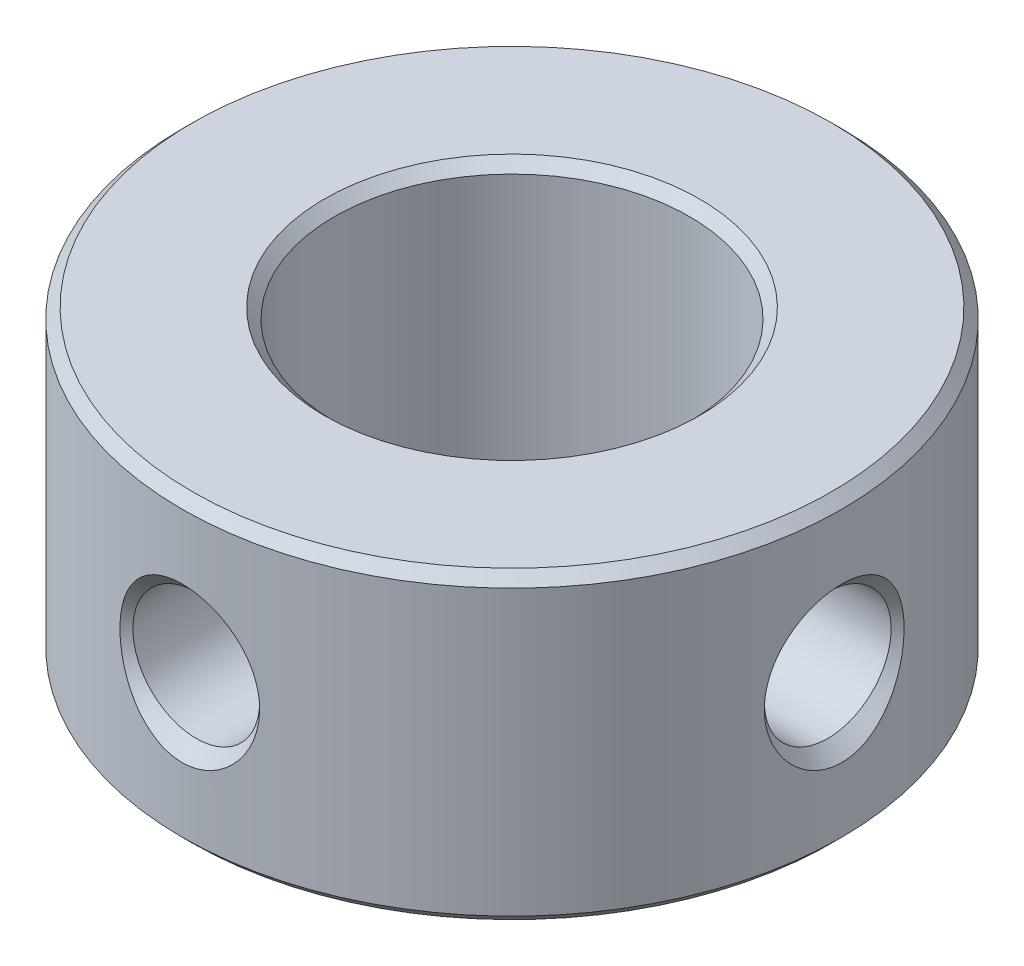
ISO-10303-21;
HEADER;
FILE_DESCRIPTION(('STEP AP214'),'2;1');
FILE_NAME('part.step','',(''),(''),'','','');
FILE_SCHEMA(('AUTOMOTIVE_DESIGN { 1 0 10303 214 1 1 1 1 }'));
ENDSEC;
DATA;
#1=APPLICATION_CONTEXT('core data for automotive mechanical design processes');
#2=APPLICATION_PROTOCOL_DEFINITION('international standard','automotive_design',2000,#1);
#3=PRODUCT_CONTEXT('',#1,'mechanical');
#4=PRODUCT('Part','Part','',(#3));
#5=PRODUCT_RELATED_PRODUCT_CATEGORY('part','',(#4));
#6=PRODUCT_DEFINITION_FORMATION('','',#4);
#7=PRODUCT_DEFINITION_CONTEXT('part definition',#1,'design');
#8=PRODUCT_DEFINITION('design','',#6,#7);
#9=PRODUCT_DEFINITION_SHAPE('','',#8);
#10=(LENGTH_UNIT() NAMED_UNIT(*) SI_UNIT(.MILLI.,.METRE.));
#11=(NAMED_UNIT(*) PLANE_ANGLE_UNIT() SI_UNIT($,.RADIAN.));
#12=(NAMED_UNIT(*) SI_UNIT($,.STERADIAN.) SOLID_ANGLE_UNIT());
#13=UNCERTAINTY_MEASURE_WITH_UNIT(LENGTH_MEASURE(1.E-05),#10,'distance_accuracy_value','');
#14=(GEOMETRIC_REPRESENTATION_CONTEXT(3) GLOBAL_UNCERTAINTY_ASSIGNED_CONTEXT((#13)) GLOBAL_UNIT_ASSIGNED_CONTEXT((#10,
#11,#12)) REPRESENTATION_CONTEXT('',''));
#15=CARTESIAN_POINT('',(0.,0.,0.));
#16=DIRECTION('',(0.,0.,1.));
#17=DIRECTION('',(1.,0.,0.));
#18=AXIS2_PLACEMENT_3D('',#15,#16,#17);
#19=CARTESIAN_POINT('',(0.,3.,0.));
#20=DIRECTION('',(0.,1.,0.));
#21=DIRECTION('',(0.,0.,1.));
#22=AXIS2_PLACEMENT_3D('',#19,#20,#21);
#23=PLANE('',#22);
#24=CARTESIAN_POINT('',(0.,3.,0.));
#25=DIRECTION('',(0.,1.,0.));
#26=DIRECTION('',(0.,0.,1.));
#27=AXIS2_PLACEMENT_3D('',#24,#25,#26);
#28=CIRCLE('',#27,3.7);
#29=CARTESIAN_POINT('',(0.,3.,3.7));
#30=VERTEX_POINT('',#29);
#31=EDGE_CURVE('E44',#30,#30,#28,.F.);
#32=ORIENTED_EDGE('',*,*,#31,.T.);
#33=EDGE_LOOP('',(#32));
#34=FACE_BOUND('',#33,.T.);
#35=CARTESIAN_POINT('',(0.,3.,0.));
#36=DIRECTION('',(0.,1.,0.));
#37=DIRECTION('',(0.,0.,1.));
#38=AXIS2_PLACEMENT_3D('',#35,#36,#37);
#39=CIRCLE('',#38,6.30000000000001);
#40=CARTESIAN_POINT('',(0.,3.,6.30000000000001));
#41=VERTEX_POINT('',#40);
#42=EDGE_CURVE('E66',#41,#41,#39,.T.);
#43=ORIENTED_EDGE('',*,*,#42,.T.);
#44=EDGE_LOOP('',(#43));
#45=FACE_BOUND('',#44,.T.);
#46=ADVANCED_FACE('F37',(#34,#45),#23,.T.);
#47=CARTESIAN_POINT('',(0.,-3.,0.));
#48=DIRECTION('',(0.,1.,0.));
#49=DIRECTION('',(0.,0.,1.));
#50=AXIS2_PLACEMENT_3D('',#47,#48,#49);
#51=PLANE('',#50);
#52=CARTESIAN_POINT('',(0.,-3.,0.));
#53=DIRECTION('',(0.,1.,0.));
#54=DIRECTION('',(0.,0.,1.));
#55=AXIS2_PLACEMENT_3D('',#52,#53,#54);
#56=CIRCLE('',#55,3.7);
#57=CARTESIAN_POINT('',(0.,-3.,3.7));
#58=VERTEX_POINT('',#57);
#59=EDGE_CURVE('E10',#58,#58,#56,.T.);
#60=ORIENTED_EDGE('',*,*,#59,.T.);
#61=EDGE_LOOP('',(#60));
#62=FACE_BOUND('',#61,.T.);
#63=CARTESIAN_POINT('',(0.,-3.,0.));
#64=DIRECTION('',(0.,1.,0.));
#65=DIRECTION('',(0.,0.,1.));
#66=AXIS2_PLACEMENT_3D('',#63,#64,#65);
#67=CIRCLE('',#66,6.3);
#68=CARTESIAN_POINT('',(0.,-3.,6.3));
#69=VERTEX_POINT('',#68);
#70=EDGE_CURVE('E57',#69,#69,#67,.F.);
#71=ORIENTED_EDGE('',*,*,#70,.T.);
#72=EDGE_LOOP('',(#71));
#73=FACE_BOUND('',#72,.T.);
#74=ADVANCED_FACE('F135',(#62,#73),#51,.F.);
#75=CARTESIAN_POINT('',(0.,3.,0.));
#76=DIRECTION('',(0.,-1.,0.));
#77=DIRECTION('',(0.,0.,-1.));
#78=AXIS2_PLACEMENT_3D('',#75,#76,#77);
#79=CYLINDRICAL_SURFACE('',#78,6.5);
#80=CARTESIAN_POINT('',(0.,2.8,0.));
#81=DIRECTION('',(0.,1.,0.));
#82=DIRECTION('',(0.,0.,1.));
#83=AXIS2_PLACEMENT_3D('',#80,#81,#82);
#84=CIRCLE('',#83,6.5);
#85=CARTESIAN_POINT('',(0.,2.8,6.5));
#86=VERTEX_POINT('',#85);
#87=EDGE_CURVE('E60',#86,#86,#84,.F.);
#88=ORIENTED_EDGE('',*,*,#87,.T.);
#89=EDGE_LOOP('',(#88));
#90=FACE_BOUND('',#89,.T.);
#91=CARTESIAN_POINT('',(0.,-2.8,0.));
#92=DIRECTION('',(0.,1.,0.));
#93=DIRECTION('',(0.,0.,1.));
#94=AXIS2_PLACEMENT_3D('',#91,#92,#93);
#95=CIRCLE('',#94,6.5);
#96=CARTESIAN_POINT('',(0.,-2.8,6.5));
#97=VERTEX_POINT('',#96);
#98=EDGE_CURVE('E63',#97,#97,#95,.T.);
#99=ORIENTED_EDGE('',*,*,#98,.T.);
#100=EDGE_LOOP('',(#99));
#101=FACE_BOUND('',#100,.T.);
#102=CARTESIAN_POINT('',(6.42056992446142,-1.03120826473283,-1.01305572553223));
#103=CARTESIAN_POINT('',(6.42775297660594,-1.08600611799098,-0.96752777206796));
#104=CARTESIAN_POINT('',(6.43506091626371,-1.13751719904323,-0.91807306619704));
#105=CARTESIAN_POINT('',(6.44930918051218,-1.232613736802,-0.811957919524479));
#106=CARTESIAN_POINT('',(6.45624943673801,-1.27619772323139,-0.755296145297524));
#107=CARTESIAN_POINT('',(6.46996026371588,-1.35909118242102,-0.627874714036797));
#108=CARTESIAN_POINT('',(6.47658997864783,-1.3970964971294,-0.556240431657065));
#109=CARTESIAN_POINT('',(6.4876766929064,-1.45912721179365,-0.406977974836262));
#110=CARTESIAN_POINT('',(6.49213461107373,-1.48315852468505,-0.329352351334137));
#111=CARTESIAN_POINT('',(6.49793086636362,-1.51414063143304,-0.178842291100535));
#112=CARTESIAN_POINT('',(6.49953900934897,-1.52257253494381,-0.106271857011151));
#113=CARTESIAN_POINT('',(6.50028804329199,-1.5265172385592,0.0392150998172214));
#114=CARTESIAN_POINT('',(6.49943003342442,-1.52203579419536,0.112131453915148));
#115=CARTESIAN_POINT('',(6.49547730671636,-1.50105511691168,0.251736262088822));
#116=CARTESIAN_POINT('',(6.49251688537915,-1.48527700794963,0.318539002443912));
#117=CARTESIAN_POINT('',(6.48482621762537,-1.44324485039578,0.448641542650498));
#118=CARTESIAN_POINT('',(6.48009577534416,-1.41698964242151,0.511940953945028));
#119=CARTESIAN_POINT('',(6.4691485903118,-1.35400244867261,0.635697968065564));
#120=CARTESIAN_POINT('',(6.46288641765774,-1.31694188553753,0.695983532255673));
#121=CARTESIAN_POINT('',(6.44957465131465,-1.23410230078908,0.810120430818683));
#122=CARTESIAN_POINT('',(6.44252478075131,-1.18832020956367,0.863969488919078));
#123=CARTESIAN_POINT('',(6.42757207945128,-1.0846468795005,0.969232991908438));
#124=CARTESIAN_POINT('',(6.41965245294934,-1.02601432085761,1.01991446746227));
#125=CARTESIAN_POINT('',(6.40438282866366,-0.901668149027933,1.111779483364));
#126=CARTESIAN_POINT('',(6.39703307615064,-0.835951515659995,1.15295894899897));
#127=CARTESIAN_POINT('',(6.3829041702812,-0.692244906097387,1.22889300887401));
#128=CARTESIAN_POINT('',(6.37625533233603,-0.613684659646156,1.26259506039481));
#129=CARTESIAN_POINT('',(6.3651691824102,-0.452124650893197,1.31734705865975));
#130=CARTESIAN_POINT('',(6.36073251298569,-0.369123606440751,1.33839332971575));
#131=CARTESIAN_POINT('',(6.35435352091555,-0.195798283722955,1.36837387948942));
#132=CARTESIAN_POINT('',(6.35257375269303,-0.10533081540766,1.37652055982645));
#133=CARTESIAN_POINT('',(6.35222654524265,0.0757456225128137,1.37812086852558));
#134=CARTESIAN_POINT('',(6.35365957103593,0.16635461070475,1.37157236990124));
#135=CARTESIAN_POINT('',(6.35962077389388,0.346692683048276,1.3436629628585));
#136=CARTESIAN_POINT('',(6.36419929699948,0.436383003235264,1.32206103114876));
#137=CARTESIAN_POINT('',(6.37595363128211,0.610732079941575,1.26415306792286));
#138=CARTESIAN_POINT('',(6.38312975289345,0.695390233667342,1.22784527887449));
#139=CARTESIAN_POINT('',(6.39909268276878,0.85596245908128,1.14170954900369));
#140=CARTESIAN_POINT('',(6.40785744197771,0.931975522598875,1.09206268010014));
#141=CARTESIAN_POINT('',(6.42595912534622,1.07382747734218,0.979929675651589));
#142=CARTESIAN_POINT('',(6.43529590710775,1.13966888642082,0.917446726452141));
#143=CARTESIAN_POINT('',(6.45272631437903,1.25472090146229,0.785169411936411));
#144=CARTESIAN_POINT('',(6.46086101406949,1.30469966987715,0.716051252342381));
#145=CARTESIAN_POINT('',(6.47542291341691,1.39072859232885,0.569467401504466));
#146=CARTESIAN_POINT('',(6.48185180042915,1.42679252679975,0.492010066655373));
#147=CARTESIAN_POINT('',(6.49148973145398,1.47978499517873,0.340147802146137));
#148=CARTESIAN_POINT('',(6.49497477034835,1.49837957855956,0.266341261861067));
#149=CARTESIAN_POINT('',(6.49938646055714,1.52181231816957,0.11651148151863));
#150=CARTESIAN_POINT('',(6.50031474468573,1.5266592540849,0.0404896875511532));
#151=CARTESIAN_POINT('',(6.49952926801496,1.52252000571488,-0.104496291229329));
#152=CARTESIAN_POINT('',(6.49803866044482,1.51470230004381,-0.173498278040829));
#153=CARTESIAN_POINT('',(6.49299773573998,1.48778483720355,-0.309174855344416));
#154=CARTESIAN_POINT('',(6.4894474742052,1.46868538458247,-0.37584950861087));
#155=CARTESIAN_POINT('',(6.48065852401051,1.42003229451611,-0.505257995514456));
#156=CARTESIAN_POINT('',(6.47541681778029,1.39045996399183,-0.56798454483699));
#157=CARTESIAN_POINT('',(6.46376580641177,1.32204067940203,-0.688022231497608));
#158=CARTESIAN_POINT('',(6.45735617866042,1.28319116179123,-0.745331865870592));
#159=CARTESIAN_POINT('',(6.44340668240451,1.19404407206132,-0.857895340394902));
#160=CARTESIAN_POINT('',(6.43581735616053,1.14307618942954,-0.912611227926875));
#161=CARTESIAN_POINT('',(6.42067711164058,1.03342561196945,-1.01366756925442));
#162=CARTESIAN_POINT('',(6.41312621134367,0.974739598896453,-1.06000440018789));
#163=CARTESIAN_POINT('',(6.39797676809255,0.844685826228736,-1.14808561080339));
#164=CARTESIAN_POINT('',(6.39045679763883,0.772633423373907,-1.18883388188948));
#165=CARTESIAN_POINT('',(6.37705459471373,0.62297311177917,-1.25874713791708));
#166=CARTESIAN_POINT('',(6.37117292821394,0.545363294775033,-1.28790812137255));
#167=CARTESIAN_POINT('',(6.36127048576103,0.380455692071845,-1.33599909729117));
#168=CARTESIAN_POINT('',(6.3574252443306,0.292869998054995,-1.35398238557953));
#169=CARTESIAN_POINT('',(6.35274816472732,0.115866262942453,-1.37575971184409));
#170=CARTESIAN_POINT('',(6.35191699778125,0.0264478181559426,-1.37955058921225));
#171=CARTESIAN_POINT('',(6.35338473995798,-0.154457715027122,-1.37277713426655));
#172=CARTESIAN_POINT('',(6.35577625533862,-0.245928468500017,-1.36178810764005));
#173=CARTESIAN_POINT('',(6.3635706376873,-0.425687190421498,-1.32488541563448));
#174=CARTESIAN_POINT('',(6.36897341269661,-0.513975255976299,-1.29897220601375));
#175=CARTESIAN_POINT('',(6.38158197215011,-0.677587063732123,-1.23546006674342));
#176=CARTESIAN_POINT('',(6.3885989202888,-0.75337735113875,-1.19902121120184));
#177=CARTESIAN_POINT('',(6.40387718885821,-0.898020673382277,-1.11453773744126));
#178=CARTESIAN_POINT('',(6.41213750173607,-0.966879250573211,-1.06650249742063));
#179=CARTESIAN_POINT('',(6.42056992446142,-1.03120826473283,-1.01305572553223));
#180=B_SPLINE_CURVE_WITH_KNOTS('',3,(#102,#103,#104,#105,#106,#107,#108,#109,#110,#111,#112,
#113,#114,#115,#116,#117,#118,#119,#120,#121,#122,#123,#124,#125,#126,#127,#128,#129,#130,#131,
#132,#133,#134,#135,#136,#137,#138,#139,#140,#141,#142,#143,#144,#145,#146,#147,#148,#149,#150,
#151,#152,#153,#154,#155,#156,#157,#158,#159,#160,#161,#162,#163,#164,#165,#166,#167,#168,#169,
#170,#171,#172,#173,#174,#175,#176,#177,#178,#179),.UNSPECIFIED.,.T.,.F.,(4,2,2,2,2,2,2,2,2,2,2,
2,2,2,2,2,2,2,2,2,2,2,2,2,2,2,2,2,2,2,2,2,2,2,2,2,2,2,4),(0.,0.214598052119018,
0.429235866292609,0.671939938853738,0.914541239152316,1.13261756724728,1.35059671287416,
1.55577634512187,1.76097868858609,1.97322214224354,2.18554043516989,2.41829066094365,
2.65114051143969,2.90724771686185,3.1634292690318,3.43472077186242,3.70605154407286,
3.98182955834019,4.2576405412277,4.5298817355946,4.80205543205084,5.05766828917701,
5.31302734858503,5.54035320297545,5.76753384710118,5.9749203286562,6.1823012121178,
6.39005413172858,6.59786452582563,6.82242354690523,7.04707942987008,7.29537179280047,
7.54374982519755,7.81101669827976,8.07834308736682,8.35351740141107,8.62868331256052,
8.88081029118063,9.132734049368),.UNSPECIFIED.);
#181=CARTESIAN_POINT('',(6.42056992446142,-1.03120826473283,-1.01305572553223));
#182=VERTEX_POINT('',#181);
#183=EDGE_CURVE('E69',#182,#182,#180,.T.);
#184=ORIENTED_EDGE('',*,*,#183,.T.);
#185=EDGE_LOOP('',(#184));
#186=FACE_BOUND('',#185,.T.);
#187=CARTESIAN_POINT('',(-1.01305572553221,-1.03120826473284,6.42056992446143));
#188=CARTESIAN_POINT('',(-1.06855792016883,-0.964402043234129,6.41181313344496));
#189=CARTESIAN_POINT('',(-1.11826126803628,-0.892661742423104,6.40323585226165));
#190=CARTESIAN_POINT('',(-1.20515376738453,-0.74173739154245,6.38745383378992));
#191=CARTESIAN_POINT('',(-1.24232002369552,-0.662540057115565,6.38025161793321));
#192=CARTESIAN_POINT('',(-1.3035840017811,-0.498788652757108,6.36801778311635));
#193=CARTESIAN_POINT('',(-1.32763872864851,-0.414217962819404,6.36299331626068));
#194=CARTESIAN_POINT('',(-1.3621035153507,-0.242270409758618,6.35570499216741));
#195=CARTESIAN_POINT('',(-1.37251847991746,-0.154894566928164,6.35344014261743));
#196=CARTESIAN_POINT('',(-1.37970645318686,0.0241961779864489,6.35188387182602));
#197=CARTESIAN_POINT('',(-1.37587765027606,0.115936979613137,6.35272361313979));
#198=CARTESIAN_POINT('',(-1.35328301862536,0.297498109988988,6.35757465484518));
#199=CARTESIAN_POINT('',(-1.33451341020379,0.38731794687312,6.36158675776992));
#200=CARTESIAN_POINT('',(-1.28224342000219,0.562821477069545,6.37232794576766));
#201=CARTESIAN_POINT('',(-1.24868133223955,0.648486157821488,6.37906840229397));
#202=CARTESIAN_POINT('',(-1.16737247582061,0.812650601438415,6.3944465405919));
#203=CARTESIAN_POINT('',(-1.11962515015357,0.891150082789759,6.40308429686119));
#204=CARTESIAN_POINT('',(-1.01238514164495,1.03610601930594,6.42089851182052));
#205=CARTESIAN_POINT('',(-0.953272355804817,1.10284525285361,6.43005214636308));
#206=CARTESIAN_POINT('',(-0.823673741146186,1.22428834194806,6.4479314920629));
#207=CARTESIAN_POINT('',(-0.753194688750855,1.27899932293893,6.45665745417615));
#208=CARTESIAN_POINT('',(-0.609124279750986,1.36961321758613,6.47176585693223));
#209=CARTESIAN_POINT('',(-0.536306352409929,1.40671932364067,6.47828443314127));
#210=CARTESIAN_POINT('',(-0.384838304299137,1.46656048735538,6.4890396001056));
#211=CARTESIAN_POINT('',(-0.306194051195555,1.48930978963318,6.49327845215169));
#212=CARTESIAN_POINT('',(-0.154855922063156,1.51738472934114,6.49854631056194));
#213=CARTESIAN_POINT('',(-0.0824783095952934,1.52437241490473,6.49988090763089));
#214=CARTESIAN_POINT('',(0.0623743915535633,1.52554578295943,6.50010354766474));
#215=CARTESIAN_POINT('',(0.134849438702086,1.5197358193918,6.49899242269897));
#216=CARTESIAN_POINT('',(0.273674314571291,1.4963051301437,6.49458762208218));
#217=CARTESIAN_POINT('',(0.340142185443195,1.47934890608643,6.49141685443643));
#218=CARTESIAN_POINT('',(0.469406134664007,1.43507371848097,6.48335218085895));
#219=CARTESIAN_POINT('',(0.532201790437165,1.40775356501369,6.47845807706957));
#220=CARTESIAN_POINT('',(0.655083254729127,1.34259138241244,6.46721147482216));
#221=CARTESIAN_POINT('',(0.714968471109569,1.30438122096042,6.46080962848138));
#222=CARTESIAN_POINT('',(0.82814750894362,1.21932454902524,6.4472805895779));
#223=CARTESIAN_POINT('',(0.881438928617808,1.17247490700968,6.44015313442642));
#224=CARTESIAN_POINT('',(0.985477351366731,1.06657648250303,6.42509651048518));
#225=CARTESIAN_POINT('',(1.03546376654017,1.00678226202533,6.41715719946399));
#226=CARTESIAN_POINT('',(1.12576449379258,0.88021938269342,6.40193373595736));
#227=CARTESIAN_POINT('',(1.16607467824246,0.813447764832675,6.39464986389045));
#228=CARTESIAN_POINT('',(1.23996344693771,0.667753087890553,6.38075597259483));
#229=CARTESIAN_POINT('',(1.27248776929155,0.588280953599429,6.3742830121596));
#230=CARTESIAN_POINT('',(1.3247315951149,0.425087547823282,6.36363092914117));
#231=CARTESIAN_POINT('',(1.34444751747298,0.341365095036177,6.35945244812391));
#232=CARTESIAN_POINT('',(1.37151384930665,0.167002938838669,6.35367286277019));
#233=CARTESIAN_POINT('',(1.37810519584138,0.0762392358161977,6.35223019097852));
#234=CARTESIAN_POINT('',(1.37654202042423,-0.105161237783578,6.35256885203277));
#235=CARTESIAN_POINT('',(1.36838540669164,-0.195797988529772,6.3543506422211));
#236=CARTESIAN_POINT('',(1.33723512580128,-0.375752018828966,6.36097937960916));
#237=CARTESIAN_POINT('',(1.31402586029198,-0.46503051922472,6.36587084608038));
#238=CARTESIAN_POINT('',(1.25295540320063,-0.638272722770767,6.37817118125727));
#239=CARTESIAN_POINT('',(1.21509253053427,-0.722235814842845,6.38558033878442));
#240=CARTESIAN_POINT('',(1.1260304648675,-0.880987953866844,6.40188007186696));
#241=CARTESIAN_POINT('',(1.07503679431001,-0.955894316657009,6.41074711701251));
#242=CARTESIAN_POINT('',(0.960375939736364,-1.09527140203972,6.42892168749749));
#243=CARTESIAN_POINT('',(0.896712413528763,-1.15974512683462,6.43822908511663));
#244=CARTESIAN_POINT('',(0.762588557887169,-1.27170497047912,6.45544150680449));
#245=CARTESIAN_POINT('',(0.692825303467547,-1.32001497879462,6.46339817815128));
#246=CARTESIAN_POINT('',(0.545271338369386,-1.40260348658392,6.47751047498678));
#247=CARTESIAN_POINT('',(0.467488770387951,-1.43689604684734,6.48366790350441));
#248=CARTESIAN_POINT('',(0.315448058977389,-1.48649649853585,6.49273717202138));
#249=CARTESIAN_POINT('',(0.24175514207226,-1.50348757782231,6.49593314369926));
#250=CARTESIAN_POINT('',(0.0924575216098046,-1.52382310142656,6.49977006605623));
#251=CARTESIAN_POINT('',(0.0168540582587083,-1.52717618077157,6.5004126334412));
#252=CARTESIAN_POINT('',(-0.127353079826083,-1.520359324668,6.49911917115738));
#253=CARTESIAN_POINT('',(-0.196014073125215,-1.51129526892918,6.49739399068914));
#254=CARTESIAN_POINT('',(-0.330834187722336,-1.48201330766334,6.4919258879967));
#255=CARTESIAN_POINT('',(-0.396992823998705,-1.46179325153277,6.48818257672951));
#256=CARTESIAN_POINT('',(-0.525576382157717,-1.4109231657829,6.47904019425626));
#257=CARTESIAN_POINT('',(-0.587970494995428,-1.38019801593903,6.4736292261715));
#258=CARTESIAN_POINT('',(-0.707144320183209,-1.30957024640088,6.46169750402781));
#259=CARTESIAN_POINT('',(-0.763927414741669,-1.26967320418682,6.45517742504963));
#260=CARTESIAN_POINT('',(-0.853070915098217,-1.19665371378187,6.44387817382912));
#261=CARTESIAN_POINT('',(-0.887262734717206,-1.16570644076113,6.43924320099983));
#262=CARTESIAN_POINT('',(-0.952532276762943,-1.10070506543029,6.42991195069592));
#263=CARTESIAN_POINT('',(-0.983610082422613,-1.06665104620536,6.42521567486363));
#264=CARTESIAN_POINT('',(-1.01305572553221,-1.03120826473284,6.42056992446143));
#265=B_SPLINE_CURVE_WITH_KNOTS('',3,(#187,#188,#189,#190,#191,#192,#193,#194,#195,#196,#197,
#198,#199,#200,#201,#202,#203,#204,#205,#206,#207,#208,#209,#210,#211,#212,#213,#214,#215,#216,
#217,#218,#219,#220,#221,#222,#223,#224,#225,#226,#227,#228,#229,#230,#231,#232,#233,#234,#235,
#236,#237,#238,#239,#240,#241,#242,#243,#244,#245,#246,#247,#248,#249,#250,#251,#252,#253,#254,
#255,#256,#257,#258,#259,#260,#261,#262,#263,#264),.UNSPECIFIED.,.T.,.F.,(4,2,2,2,2,2,2,2,2,2,2,
2,2,2,2,2,2,2,2,2,2,2,2,2,2,2,2,2,2,2,2,2,2,2,2,2,2,2,4),(0.,0.261709761652983,0.52389490109718,
0.786934695087148,1.04987987641283,1.32405843714444,1.5983063808254,1.87370932427814,
2.1491230833885,2.41656642805268,2.68385091187216,2.92842201901193,3.17275008306625,
3.3897933279594,3.60676274307551,3.81184529672764,4.01695140375685,4.23004035206384,
4.44320669058574,4.67725388064131,4.91140073244233,5.16861264147254,5.42589643368387,
5.69767220384765,5.96948652442109,6.2452826661925,6.52111045710396,6.79285883159098,
7.06452886538144,7.31878814479525,7.57279174916208,7.79863649233791,8.02433821752089,
8.23119234289762,8.4380863586219,8.6464919039936,8.85477105043553,8.99361994328311,
9.13246512391758),.UNSPECIFIED.);
#266=CARTESIAN_POINT('',(-1.01305572553221,-1.03120826473284,6.42056992446143));
#267=VERTEX_POINT('',#266);
#268=EDGE_CURVE('E77',#267,#267,#265,.T.);
#269=ORIENTED_EDGE('',*,*,#268,.T.);
#270=EDGE_LOOP('',(#269));
#271=FACE_BOUND('',#270,.T.);
#272=ADVANCED_FACE('F83',(#90,#101,#186,#271),#79,.T.);
#273=CARTESIAN_POINT('',(0.,3.,0.));
#274=DIRECTION('',(0.,-1.,0.));
#275=DIRECTION('',(0.,0.,-1.));
#276=AXIS2_PLACEMENT_3D('',#273,#274,#275);
#277=CYLINDRICAL_SURFACE('',#276,3.5);
#278=CARTESIAN_POINT('',(0.,2.8,0.));
#279=DIRECTION('',(0.,1.,0.));
#280=DIRECTION('',(0.,0.,1.));
#281=AXIS2_PLACEMENT_3D('',#278,#279,#280);
#282=CIRCLE('',#281,3.5);
#283=CARTESIAN_POINT('',(0.,2.8,3.5));
#284=VERTEX_POINT('',#283);
#285=EDGE_CURVE('E48',#284,#284,#282,.T.);
#286=ORIENTED_EDGE('',*,*,#285,.T.);
#287=EDGE_LOOP('',(#286));
#288=FACE_BOUND('',#287,.T.);
#289=CARTESIAN_POINT('',(0.,-2.8,0.));
#290=DIRECTION('',(0.,1.,0.));
#291=DIRECTION('',(0.,0.,1.));
#292=AXIS2_PLACEMENT_3D('',#289,#290,#291);
#293=CIRCLE('',#292,3.5);
#294=CARTESIAN_POINT('',(0.,-2.8,3.5));
#295=VERTEX_POINT('',#294);
#296=EDGE_CURVE('E52',#295,#295,#293,.F.);
#297=ORIENTED_EDGE('',*,*,#296,.T.);
#298=EDGE_LOOP('',(#297));
#299=FACE_BOUND('',#298,.T.);
#300=CARTESIAN_POINT('',(3.2691742076555,0.,-1.25000000000001));
#301=CARTESIAN_POINT('',(3.26917292438196,-0.0677635311829891,-1.25000146571681));
#302=CARTESIAN_POINT('',(3.27130407050731,-0.13551693177872,-1.24447124723088));
#303=CARTESIAN_POINT('',(3.2795455772838,-0.268996459464491,-1.22258548426209));
#304=CARTESIAN_POINT('',(3.28565613446977,-0.334722486258831,-1.20622940511183));
#305=CARTESIAN_POINT('',(3.30107790836764,-0.462187379537954,-1.16335593318026));
#306=CARTESIAN_POINT('',(3.31038208131089,-0.523934668426035,-1.13686088802959));
#307=CARTESIAN_POINT('',(3.33113188929166,-0.642130434394742,-1.07453961334163));
#308=CARTESIAN_POINT('',(3.34257809808702,-0.698577485675431,-1.03871088270725));
#309=CARTESIAN_POINT('',(3.36689966125499,-0.807110599456308,-0.957012237945714));
#310=CARTESIAN_POINT('',(3.37981431712589,-0.858923931031954,-0.910791620570078));
#311=CARTESIAN_POINT('',(3.40528790174668,-0.95425342434053,-0.810367255990536));
#312=CARTESIAN_POINT('',(3.41784676295918,-0.997768019663904,-0.756162005080279));
#313=CARTESIAN_POINT('',(3.4416554889862,-1.07654454342637,-0.639270438808919));
#314=CARTESIAN_POINT('',(3.45285383406513,-1.11151474621512,-0.576376093851279));
#315=CARTESIAN_POINT('',(3.47221153381931,-1.17026752772694,-0.445127531707937));
#316=CARTESIAN_POINT('',(3.48037183737504,-1.1940536002339,-0.376775027399546));
#317=CARTESIAN_POINT('',(3.49245530799316,-1.22882047440004,-0.239414363324661));
#318=CARTESIAN_POINT('',(3.49653304673083,-1.24026978011776,-0.170538642602665));
#319=CARTESIAN_POINT('',(3.50054398952422,-1.25153419491385,-0.0317308606240404));
#320=CARTESIAN_POINT('',(3.50047841683989,-1.2513527378266,0.0382008827594555));
#321=CARTESIAN_POINT('',(3.49631130383425,-1.23964440121769,0.173796186747263));
#322=CARTESIAN_POINT('',(3.49239127067778,-1.22862774680892,0.239510325909282));
#323=CARTESIAN_POINT('',(3.4811892594591,-1.19641357442843,0.368087065850924));
#324=CARTESIAN_POINT('',(3.47390704664956,-1.17521534557513,0.430949467185612));
#325=CARTESIAN_POINT('',(3.45658253893038,-1.12297654208709,0.553080483404841));
#326=CARTESIAN_POINT('',(3.44650297132745,-1.09180211650239,0.612286340929418));
#327=CARTESIAN_POINT('',(3.4246167895169,-1.02061042995104,0.724767597934818));
#328=CARTESIAN_POINT('',(3.41280964940656,-0.980590474352201,0.778041182802267));
#329=CARTESIAN_POINT('',(3.38795176821394,-0.890334612032681,0.880166240160404));
#330=CARTESIAN_POINT('',(3.37486828997373,-0.839666549027765,0.928628391331513));
#331=CARTESIAN_POINT('',(3.34944981191469,-0.730828256290598,1.01650555440788));
#332=CARTESIAN_POINT('',(3.33711496612903,-0.672656490294308,1.05591870906857));
#333=CARTESIAN_POINT('',(3.31439562189587,-0.549061174022119,1.12522950569522));
#334=CARTESIAN_POINT('',(3.30405138321181,-0.483523466718079,1.1549378187936));
#335=CARTESIAN_POINT('',(3.28694869806869,-0.347910273952615,1.20275553291114));
#336=CARTESIAN_POINT('',(3.2801884778585,-0.277837052447113,1.22087067237906));
#337=CARTESIAN_POINT('',(3.27143002768992,-0.138958057132071,1.24414358032315));
#338=CARTESIAN_POINT('',(3.26920708180296,-0.0702690936653887,1.24991352345504));
#339=CARTESIAN_POINT('',(3.26914209334097,0.0671166876127439,1.25008448921424));
#340=CARTESIAN_POINT('',(3.27129909588942,0.135813500448046,1.2444879898499));
#341=CARTESIAN_POINT('',(3.27952452452363,0.268286887362551,1.22263799772667));
#342=CARTESIAN_POINT('',(3.2854270877436,0.332149371788167,1.20683592994392));
#343=CARTESIAN_POINT('',(3.30028809464656,0.456294957497105,1.16557961975035));
#344=CARTESIAN_POINT('',(3.30924712838686,0.516577364999691,1.14012351350349));
#345=CARTESIAN_POINT('',(3.32959948938642,0.634200088743956,1.07927201741357));
#346=CARTESIAN_POINT('',(3.34106719910993,0.691362962891274,1.0435592275448));
#347=CARTESIAN_POINT('',(3.3650114872521,0.799103860401537,0.963555281036759));
#348=CARTESIAN_POINT('',(3.3774884033877,0.849679664591281,0.919261245827026));
#349=CARTESIAN_POINT('',(3.40289783219847,0.945771344998106,0.820385217502014));
#350=CARTESIAN_POINT('',(3.41581623964054,0.99083969273136,0.765363258315917));
#351=CARTESIAN_POINT('',(3.43996864684917,1.07114634252535,0.648218571817379));
#352=CARTESIAN_POINT('',(3.45120267476867,1.10638480889246,0.586095963216691));
#353=CARTESIAN_POINT('',(3.47068992079872,1.16575011170408,0.456690236963203));
#354=CARTESIAN_POINT('',(3.47895813089701,1.18993300873033,0.389435219661477));
#355=CARTESIAN_POINT('',(3.49164167991555,1.22652342952858,0.251453449460858));
#356=CARTESIAN_POINT('',(3.49605864126052,1.23893591204424,0.180728171763221));
#357=CARTESIAN_POINT('',(3.50040190941305,1.25113648332217,0.0418787546430568));
#358=CARTESIAN_POINT('',(3.50055532713249,1.25156305322446,-0.0261827249779481));
#359=CARTESIAN_POINT('',(3.49693182545721,1.24139231150663,-0.161363401845748));
#360=CARTESIAN_POINT('',(3.49315530819591,1.23079612779776,-0.228482694790286));
#361=CARTESIAN_POINT('',(3.48219155536997,1.19931993535221,-0.35849066116531));
#362=CARTESIAN_POINT('',(3.4750756404023,1.17865463831576,-0.42143777799966));
#363=CARTESIAN_POINT('',(3.45816943849313,1.12783345463454,-0.542985717130849));
#364=CARTESIAN_POINT('',(3.44837865047326,1.0976757896432,-0.601585722474552));
#365=CARTESIAN_POINT('',(3.42662745242743,1.02734432383809,-0.71534116903705));
#366=CARTESIAN_POINT('',(3.41459585580278,0.986817762450785,-0.770264674501983));
#367=CARTESIAN_POINT('',(3.3898552302368,0.897473770404153,-0.872734236383788));
#368=CARTESIAN_POINT('',(3.37714597079416,0.848653506208336,-0.920277760776981));
#369=CARTESIAN_POINT('',(3.35176441921255,0.741390586412938,-1.00891110432272));
#370=CARTESIAN_POINT('',(3.33912156501335,0.682605061290538,-1.04959590102613));
#371=CARTESIAN_POINT('',(3.31600175800823,0.558630792844624,-1.12050399405575));
#372=CARTESIAN_POINT('',(3.30552465910575,0.493442481875288,-1.1507279961344));
#373=CARTESIAN_POINT('',(3.28804606616515,0.358129538081378,-1.19976666603698));
#374=CARTESIAN_POINT('',(3.28105913209347,0.28798559681381,-1.2185336093736));
#375=CARTESIAN_POINT('',(3.27162502953463,0.145223053231195,-1.24364637412569));
#376=CARTESIAN_POINT('',(3.26917558262796,0.0726057115564082,-1.24999842954745));
#377=CARTESIAN_POINT('',(3.2691742076555,0.,-1.25000000000001));
#378=B_SPLINE_CURVE_WITH_KNOTS('',3,(#300,#301,#302,#303,#304,#305,#306,#307,#308,#309,#310,
#311,#312,#313,#314,#315,#316,#317,#318,#319,#320,#321,#322,#323,#324,#325,#326,#327,#328,#329,
#330,#331,#332,#333,#334,#335,#336,#337,#338,#339,#340,#341,#342,#343,#344,#345,#346,#347,#348,
#349,#350,#351,#352,#353,#354,#355,#356,#357,#358,#359,#360,#361,#362,#363,#364,#365,#366,#367,
#368,#369,#370,#371,#372,#373,#374,#375,#376,#377),.UNSPECIFIED.,.T.,.F.,(4,2,2,2,2,2,2,2,2,2,2,
2,2,2,2,2,2,2,2,2,2,2,2,2,2,2,2,2,2,2,2,2,2,2,2,2,2,2,4),(0.,0.203020883138164,
0.406051793815671,0.608637751162817,0.811278050310595,1.02220501259777,1.23317174861701,
1.45056406841855,1.66788843235755,1.8766323011199,2.08531454120126,2.28461868668642,
2.48393674968961,2.6860498552956,2.88822461610465,3.10122083881643,3.31426073854221,
3.53123804647411,3.74810787062261,3.95394726789477,4.15974179475174,4.3570047091319,
4.55430572705357,4.75852942964241,4.96282175786678,5.17866024153271,5.39449511724438,
5.60922305543412,5.82386049090847,6.02704135069305,6.23020142189365,6.42920732216895,
6.62825052739449,6.83526508050382,7.04235050272175,7.25910581081149,7.47584649234334,
7.6934839563833,7.91101210793803),.UNSPECIFIED.);
#379=CARTESIAN_POINT('',(3.2691742076555,0.,-1.25000000000001));
#380=VERTEX_POINT('',#379);
#381=EDGE_CURVE('E101',#380,#380,#378,.T.);
#382=ORIENTED_EDGE('',*,*,#381,.F.);
#383=EDGE_LOOP('',(#382));
#384=FACE_BOUND('',#383,.T.);
#385=CARTESIAN_POINT('',(1.25,0.,3.26917420765551));
#386=CARTESIAN_POINT('',(1.25000146571679,-0.067763531182989,3.26917292438196));
#387=CARTESIAN_POINT('',(1.24447124723087,-0.13551693177872,3.27130407050731));
#388=CARTESIAN_POINT('',(1.22258548426207,-0.268996459464491,3.27954557728381));
#389=CARTESIAN_POINT('',(1.20622940511182,-0.334722486258831,3.28565613446978));
#390=CARTESIAN_POINT('',(1.16335593318025,-0.462187379537954,3.30107790836764));
#391=CARTESIAN_POINT('',(1.13686088802958,-0.523934668426035,3.3103820813109));
#392=CARTESIAN_POINT('',(1.07453961334162,-0.642130434394742,3.33113188929167));
#393=CARTESIAN_POINT('',(1.03871088270724,-0.698577485675431,3.34257809808702));
#394=CARTESIAN_POINT('',(0.957012237945701,-0.807110599456308,3.36689966125499));
#395=CARTESIAN_POINT('',(0.910791620570066,-0.858923931031953,3.3798143171259));
#396=CARTESIAN_POINT('',(0.810367255990524,-0.95425342434053,3.40528790174668));
#397=CARTESIAN_POINT('',(0.756162005080266,-0.997768019663904,3.41784676295918));
#398=CARTESIAN_POINT('',(0.639270438808906,-1.07654454342637,3.4416554889862));
#399=CARTESIAN_POINT('',(0.576376093851266,-1.11151474621512,3.45285383406514));
#400=CARTESIAN_POINT('',(0.445127531707924,-1.17026752772694,3.47221153381931));
#401=CARTESIAN_POINT('',(0.376775027399534,-1.1940536002339,3.48037183737504));
#402=CARTESIAN_POINT('',(0.239414363324648,-1.22882047440004,3.49245530799316));
#403=CARTESIAN_POINT('',(0.170538642602652,-1.24026978011776,3.49653304673083));
#404=CARTESIAN_POINT('',(0.0317308606240277,-1.25153419491385,3.50054398952422));
#405=CARTESIAN_POINT('',(-0.0382008827594682,-1.2513527378266,3.50047841683989));
#406=CARTESIAN_POINT('',(-0.173796186747275,-1.23964440121769,3.49631130383425));
#407=CARTESIAN_POINT('',(-0.239510325909294,-1.22862774680892,3.49239127067778));
#408=CARTESIAN_POINT('',(-0.368087065850936,-1.19641357442842,3.4811892594591));
#409=CARTESIAN_POINT('',(-0.430949467185624,-1.17521534557513,3.47390704664955));
#410=CARTESIAN_POINT('',(-0.553080483404853,-1.12297654208709,3.45658253893038));
#411=CARTESIAN_POINT('',(-0.61228634092943,-1.09180211650239,3.44650297132745));
#412=CARTESIAN_POINT('',(-0.72476759793483,-1.02061042995104,3.4246167895169));
#413=CARTESIAN_POINT('',(-0.778041182802279,-0.9805904743522,3.41280964940655));
#414=CARTESIAN_POINT('',(-0.880166240160416,-0.89033461203268,3.38795176821394));
#415=CARTESIAN_POINT('',(-0.928628391331524,-0.839666549027765,3.37486828997373));
#416=CARTESIAN_POINT('',(-1.01650555440789,-0.730828256290598,3.34944981191469));
#417=CARTESIAN_POINT('',(-1.05591870906858,-0.672656490294308,3.33711496612903));
#418=CARTESIAN_POINT('',(-1.12522950569523,-0.549061174022119,3.31439562189586));
#419=CARTESIAN_POINT('',(-1.15493781879361,-0.483523466718079,3.30405138321181));
#420=CARTESIAN_POINT('',(-1.20275553291115,-0.347910273952614,3.28694869806869));
#421=CARTESIAN_POINT('',(-1.22087067237907,-0.277837052447113,3.2801884778585));
#422=CARTESIAN_POINT('',(-1.24414358032316,-0.13895805713207,3.27143002768992));
#423=CARTESIAN_POINT('',(-1.24991352345505,-0.0702690936653879,3.26920708180296));
#424=CARTESIAN_POINT('',(-1.25008448921425,0.0671166876127447,3.26914209334096));
#425=CARTESIAN_POINT('',(-1.24448798984991,0.135813500448046,3.27129909588941));
#426=CARTESIAN_POINT('',(-1.22263799772668,0.268286887362551,3.27952452452363));
#427=CARTESIAN_POINT('',(-1.20683592994393,0.332149371788167,3.28542708774359));
#428=CARTESIAN_POINT('',(-1.16557961975037,0.456294957497105,3.30028809464655));
#429=CARTESIAN_POINT('',(-1.1401235135035,0.516577364999691,3.30924712838686));
#430=CARTESIAN_POINT('',(-1.07927201741359,0.634200088743956,3.32959948938642));
#431=CARTESIAN_POINT('',(-1.04355922754481,0.691362962891274,3.34106719910993));
#432=CARTESIAN_POINT('',(-0.96355528103677,0.799103860401537,3.3650114872521));
#433=CARTESIAN_POINT('',(-0.919261245827037,0.849679664591281,3.3774884033877));
#434=CARTESIAN_POINT('',(-0.820385217502025,0.945771344998106,3.40289783219847));
#435=CARTESIAN_POINT('',(-0.765363258315928,0.99083969273136,3.41581623964053));
#436=CARTESIAN_POINT('',(-0.64821857181739,1.07114634252535,3.43996864684916));
#437=CARTESIAN_POINT('',(-0.586095963216702,1.10638480889246,3.45120267476866));
#438=CARTESIAN_POINT('',(-0.456690236963214,1.16575011170408,3.47068992079872));
#439=CARTESIAN_POINT('',(-0.389435219661489,1.18993300873033,3.47895813089701));
#440=CARTESIAN_POINT('',(-0.25145344946087,1.22652342952858,3.49164167991555));
#441=CARTESIAN_POINT('',(-0.180728171763232,1.23893591204424,3.49605864126052));
#442=CARTESIAN_POINT('',(-0.0418787546430685,1.25113648332217,3.50040190941305));
#443=CARTESIAN_POINT('',(0.0261827249779362,1.25156305322446,3.50055532713249));
#444=CARTESIAN_POINT('',(0.161363401845736,1.24139231150663,3.49693182545721));
#445=CARTESIAN_POINT('',(0.228482694790274,1.23079612779776,3.49315530819592));
#446=CARTESIAN_POINT('',(0.358490661165298,1.19931993535221,3.48219155536997));
#447=CARTESIAN_POINT('',(0.421437777999648,1.17865463831576,3.47507564040231));
#448=CARTESIAN_POINT('',(0.542985717130837,1.12783345463454,3.45816943849313));
#449=CARTESIAN_POINT('',(0.60158572247454,1.0976757896432,3.44837865047326));
#450=CARTESIAN_POINT('',(0.715341169037038,1.02734432383809,3.42662745242743));
#451=CARTESIAN_POINT('',(0.770264674501971,0.986817762450784,3.41459585580279));
#452=CARTESIAN_POINT('',(0.872734236383776,0.897473770404152,3.3898552302368));
#453=CARTESIAN_POINT('',(0.920277760776969,0.848653506208335,3.37714597079416));
#454=CARTESIAN_POINT('',(1.00891110432271,0.741390586412937,3.35176441921256));
#455=CARTESIAN_POINT('',(1.04959590102612,0.682605061290536,3.33912156501336));
#456=CARTESIAN_POINT('',(1.12050399405574,0.558630792844622,3.31600175800823));
#457=CARTESIAN_POINT('',(1.15072799613439,0.493442481875286,3.30552465910575));
#458=CARTESIAN_POINT('',(1.19976666603697,0.358129538081377,3.28804606616516));
#459=CARTESIAN_POINT('',(1.21853360937359,0.287985596813808,3.28105913209347));
#460=CARTESIAN_POINT('',(1.24364637412568,0.145223053231195,3.27162502953463));
#461=CARTESIAN_POINT('',(1.24999842954744,0.0726057115564078,3.26917558262796));
#462=CARTESIAN_POINT('',(1.25,0.,3.26917420765551));
#463=B_SPLINE_CURVE_WITH_KNOTS('',3,(#385,#386,#387,#388,#389,#390,#391,#392,#393,#394,#395,
#396,#397,#398,#399,#400,#401,#402,#403,#404,#405,#406,#407,#408,#409,#410,#411,#412,#413,#414,
#415,#416,#417,#418,#419,#420,#421,#422,#423,#424,#425,#426,#427,#428,#429,#430,#431,#432,#433,
#434,#435,#436,#437,#438,#439,#440,#441,#442,#443,#444,#445,#446,#447,#448,#449,#450,#451,#452,
#453,#454,#455,#456,#457,#458,#459,#460,#461,#462),.UNSPECIFIED.,.T.,.F.,(4,2,2,2,2,2,2,2,2,2,2,
2,2,2,2,2,2,2,2,2,2,2,2,2,2,2,2,2,2,2,2,2,2,2,2,2,2,2,4),(0.,0.203020883138164,
0.406051793815671,0.608637751162817,0.811278050310595,1.02220501259777,1.23317174861701,
1.45056406841855,1.66788843235755,1.8766323011199,2.08531454120126,2.28461868668642,
2.48393674968961,2.6860498552956,2.88822461610465,3.10122083881643,3.31426073854221,
3.53123804647411,3.74810787062261,3.95394726789476,4.15974179475174,4.3570047091319,
4.55430572705357,4.75852942964241,4.96282175786678,5.17866024153271,5.39449511724438,
5.60922305543412,5.82386049090847,6.02704135069305,6.23020142189364,6.42920732216895,
6.62825052739449,6.83526508050382,7.04235050272175,7.25910581081149,7.47584649234333,
7.69348395638329,7.91101210793802),.UNSPECIFIED.);
#464=CARTESIAN_POINT('',(1.25,0.,3.26917420765551));
#465=VERTEX_POINT('',#464);
#466=EDGE_CURVE('E111',#465,#465,#463,.T.);
#467=ORIENTED_EDGE('',*,*,#466,.F.);
#468=EDGE_LOOP('',(#467));
#469=FACE_BOUND('',#468,.T.);
#470=ADVANCED_FACE('F126',(#288,#299,#384,#469),#277,.F.);
#471=CARTESIAN_POINT('',(0.,0.,6.5));
#472=DIRECTION('',(0.,0.,1.));
#473=DIRECTION('',(1.,0.,0.));
#474=AXIS2_PLACEMENT_3D('',#471,#472,#473);
#475=CONICAL_SURFACE('',#474,1.525,0.78539816339745);
#476=CARTESIAN_POINT('',(0.,0.,6.225));
#477=DIRECTION('',(0.,0.,1.));
#478=DIRECTION('',(1.,0.,0.));
#479=AXIS2_PLACEMENT_3D('',#476,#477,#478);
#480=CIRCLE('',#479,1.25);
#481=CARTESIAN_POINT('',(1.25,0.,6.225));
#482=VERTEX_POINT('',#481);
#483=EDGE_CURVE('E108',#482,#482,#480,.T.);
#484=ORIENTED_EDGE('',*,*,#483,.F.);
#485=EDGE_LOOP('',(#484));
#486=FACE_BOUND('',#485,.T.);
#487=ORIENTED_EDGE('',*,*,#268,.F.);
#488=EDGE_LOOP('',(#487));
#489=FACE_BOUND('',#488,.T.);
#490=ADVANCED_FACE('F122',(#486,#489),#475,.F.);
#491=CARTESIAN_POINT('',(0.,0.,6.5));
#492=DIRECTION('',(0.,0.,1.));
#493=DIRECTION('',(1.,0.,0.));
#494=AXIS2_PLACEMENT_3D('',#491,#492,#493);
#495=CYLINDRICAL_SURFACE('',#494,1.25);
#496=ORIENTED_EDGE('',*,*,#483,.T.);
#497=EDGE_LOOP('',(#496));
#498=FACE_BOUND('',#497,.T.);
#499=ORIENTED_EDGE('',*,*,#466,.T.);
#500=EDGE_LOOP('',(#499));
#501=FACE_BOUND('',#500,.T.);
#502=ADVANCED_FACE('F92',(#498,#501),#495,.F.);
#503=CARTESIAN_POINT('',(6.5,0.,0.));
#504=DIRECTION('',(1.,0.,0.));
#505=DIRECTION('',(0.,0.,-1.));
#506=AXIS2_PLACEMENT_3D('',#503,#504,#505);
#507=CONICAL_SURFACE('',#506,1.525,0.78539816339745);
#508=CARTESIAN_POINT('',(6.225,0.,0.));
#509=DIRECTION('',(1.,0.,0.));
#510=DIRECTION('',(0.,0.,-1.));
#511=AXIS2_PLACEMENT_3D('',#508,#509,#510);
#512=CIRCLE('',#511,1.25);
#513=CARTESIAN_POINT('',(6.225,0.,-1.25000000000002));
#514=VERTEX_POINT('',#513);
#515=EDGE_CURVE('E109',#514,#514,#512,.T.);
#516=ORIENTED_EDGE('',*,*,#515,.F.);
#517=EDGE_LOOP('',(#516));
#518=FACE_BOUND('',#517,.T.);
#519=ORIENTED_EDGE('',*,*,#183,.F.);
#520=EDGE_LOOP('',(#519));
#521=FACE_BOUND('',#520,.T.);
#522=ADVANCED_FACE('F87',(#518,#521),#507,.F.);
#523=CARTESIAN_POINT('',(6.5,0.,0.));
#524=DIRECTION('',(1.,0.,0.));
#525=DIRECTION('',(0.,0.,-1.));
#526=AXIS2_PLACEMENT_3D('',#523,#524,#525);
#527=CYLINDRICAL_SURFACE('',#526,1.25);
#528=ORIENTED_EDGE('',*,*,#515,.T.);
#529=EDGE_LOOP('',(#528));
#530=FACE_BOUND('',#529,.T.);
#531=ORIENTED_EDGE('',*,*,#381,.T.);
#532=EDGE_LOOP('',(#531));
#533=FACE_BOUND('',#532,.T.);
#534=ADVANCED_FACE('F91',(#530,#533),#527,.F.);
#535=CARTESIAN_POINT('',(0.,3.,0.));
#536=DIRECTION('',(0.,-1.,0.));
#537=DIRECTION('',(0.,0.,-1.));
#538=AXIS2_PLACEMENT_3D('',#535,#536,#537);
#539=CONICAL_SURFACE('',#538,6.30000000000001,0.785398163397444);
#540=ORIENTED_EDGE('',*,*,#87,.F.);
#541=EDGE_LOOP('',(#540));
#542=FACE_BOUND('',#541,.T.);
#543=ORIENTED_EDGE('',*,*,#42,.F.);
#544=EDGE_LOOP('',(#543));
#545=FACE_BOUND('',#544,.T.);
#546=ADVANCED_FACE('F97',(#542,#545),#539,.T.);
#547=CARTESIAN_POINT('',(0.,-2.8,0.));
#548=DIRECTION('',(0.,1.,0.));
#549=DIRECTION('',(0.,0.,1.));
#550=AXIS2_PLACEMENT_3D('',#547,#548,#549);
#551=CONICAL_SURFACE('',#550,6.5,0.78539816339745);
#552=ORIENTED_EDGE('',*,*,#70,.F.);
#553=EDGE_LOOP('',(#552));
#554=FACE_BOUND('',#553,.T.);
#555=ORIENTED_EDGE('',*,*,#98,.F.);
#556=EDGE_LOOP('',(#555));
#557=FACE_BOUND('',#556,.T.);
#558=ADVANCED_FACE('F144',(#554,#557),#551,.T.);
#559=CARTESIAN_POINT('',(0.,2.8,0.));
#560=DIRECTION('',(0.,1.,0.));
#561=DIRECTION('',(0.,0.,1.));
#562=AXIS2_PLACEMENT_3D('',#559,#560,#561);
#563=CONICAL_SURFACE('',#562,3.5,0.785398163397445);
#564=ORIENTED_EDGE('',*,*,#31,.F.);
#565=EDGE_LOOP('',(#564));
#566=FACE_BOUND('',#565,.T.);
#567=ORIENTED_EDGE('',*,*,#285,.F.);
#568=EDGE_LOOP('',(#567));
#569=FACE_BOUND('',#568,.T.);
#570=ADVANCED_FACE('F149',(#566,#569),#563,.F.);
#571=CARTESIAN_POINT('',(0.,-3.,0.));
#572=DIRECTION('',(0.,-1.,0.));
#573=DIRECTION('',(0.,0.,-1.));
#574=AXIS2_PLACEMENT_3D('',#571,#572,#573);
#575=CONICAL_SURFACE('',#574,3.7,0.785398163397443);
#576=ORIENTED_EDGE('',*,*,#296,.F.);
#577=EDGE_LOOP('',(#576));
#578=FACE_BOUND('',#577,.T.);
#579=ORIENTED_EDGE('',*,*,#59,.F.);
#580=EDGE_LOOP('',(#579));
#581=FACE_BOUND('',#580,.T.);
#582=ADVANCED_FACE('F39',(#578,#581),#575,.F.);
#583=CLOSED_SHELL('',(#46,#74,#272,#470,#490,#502,#522,#534,#546,#558,#570,#582));
#584=MANIFOLD_SOLID_BREP('B2',#583);
#585=ADVANCED_BREP_SHAPE_REPRESENTATION('',(#18,#584),#14);
#586=SHAPE_DEFINITION_REPRESENTATION(#9,#585);
ENDSEC;
END-ISO-10303-21;
